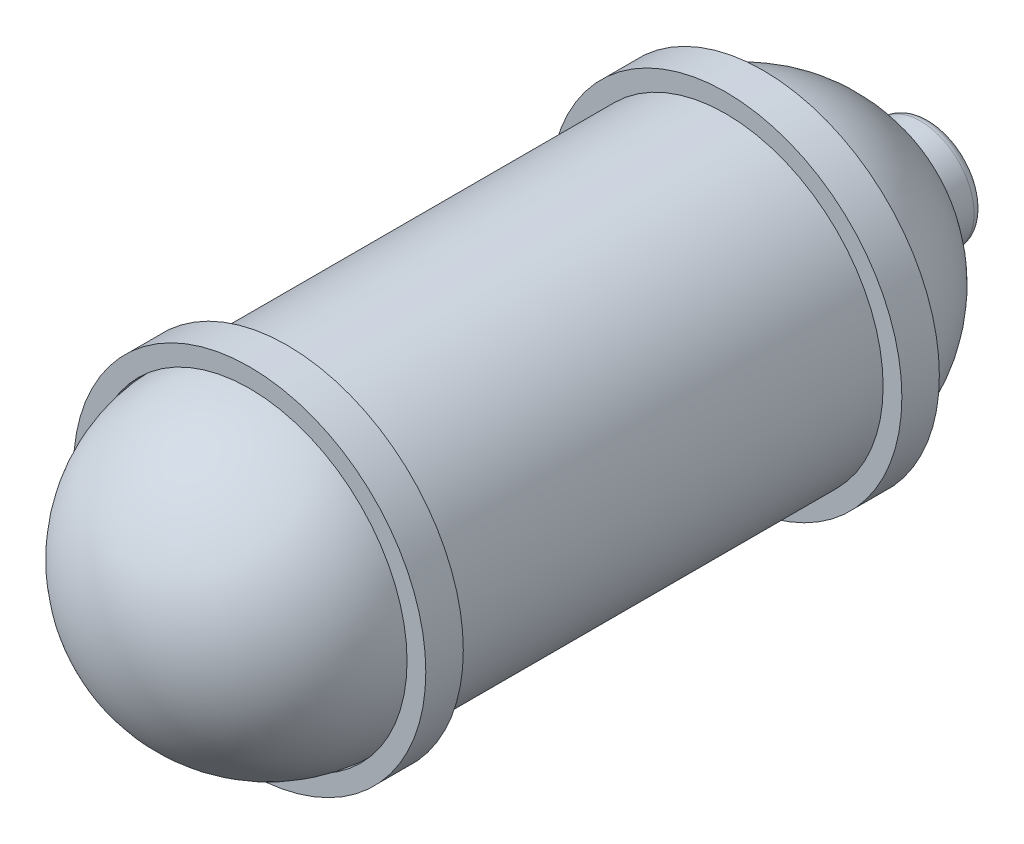
ISO-10303-21;
HEADER;
FILE_DESCRIPTION(('STEP AP214'),'2;1');
FILE_NAME('part.step','',(''),(''),'','','');
FILE_SCHEMA(('AUTOMOTIVE_DESIGN { 1 0 10303 214 1 1 1 1 }'));
ENDSEC;
DATA;
#1=APPLICATION_CONTEXT('core data for automotive mechanical design processes');
#2=APPLICATION_PROTOCOL_DEFINITION('international standard','automotive_design',2000,#1);
#3=PRODUCT_CONTEXT('',#1,'mechanical');
#4=PRODUCT('Part','Part','',(#3));
#5=PRODUCT_RELATED_PRODUCT_CATEGORY('part','',(#4));
#6=PRODUCT_DEFINITION_FORMATION('','',#4);
#7=PRODUCT_DEFINITION_CONTEXT('part definition',#1,'design');
#8=PRODUCT_DEFINITION('design','',#6,#7);
#9=PRODUCT_DEFINITION_SHAPE('','',#8);
#10=(LENGTH_UNIT() NAMED_UNIT(*) SI_UNIT(.MILLI.,.METRE.));
#11=(NAMED_UNIT(*) PLANE_ANGLE_UNIT() SI_UNIT($,.RADIAN.));
#12=(NAMED_UNIT(*) SI_UNIT($,.STERADIAN.) SOLID_ANGLE_UNIT());
#13=UNCERTAINTY_MEASURE_WITH_UNIT(LENGTH_MEASURE(1.E-05),#10,'distance_accuracy_value','');
#14=(GEOMETRIC_REPRESENTATION_CONTEXT(3) GLOBAL_UNCERTAINTY_ASSIGNED_CONTEXT((#13)) GLOBAL_UNIT_ASSIGNED_CONTEXT((#10,
#11,#12)) REPRESENTATION_CONTEXT('',''));
#15=CARTESIAN_POINT('',(0.,0.,0.));
#16=DIRECTION('',(0.,0.,1.));
#17=DIRECTION('',(1.,0.,0.));
#18=AXIS2_PLACEMENT_3D('',#15,#16,#17);
#19=CARTESIAN_POINT('',(0.,0.,-2210.));
#20=DIRECTION('',(0.,0.,1.));
#21=DIRECTION('',(1.,0.,0.));
#22=AXIS2_PLACEMENT_3D('',#19,#20,#21);
#23=TOROIDAL_SURFACE('',#22,235.482048472404,50.);
#24=CARTESIAN_POINT('',(0.,0.,-2260.));
#25=DIRECTION('',(0.,0.,1.));
#26=DIRECTION('',(1.,0.,0.));
#27=AXIS2_PLACEMENT_3D('',#24,#25,#26);
#28=CIRCLE('',#27,235.482048472404);
#29=CARTESIAN_POINT('',(235.482048472404,0.,-2260.));
#30=VERTEX_POINT('',#29);
#31=EDGE_CURVE('E47',#30,#30,#28,.F.);
#32=ORIENTED_EDGE('',*,*,#31,.F.);
#33=EDGE_LOOP('',(#32));
#34=FACE_BOUND('',#33,.T.);
#35=CARTESIAN_POINT('',(0.,0.,-2210.));
#36=DIRECTION('',(0.,0.,1.));
#37=DIRECTION('',(1.,0.,0.));
#38=AXIS2_PLACEMENT_3D('',#35,#36,#37);
#39=CIRCLE('',#38,285.482048472404);
#40=CARTESIAN_POINT('',(285.482048472404,0.,-2210.));
#41=VERTEX_POINT('',#40);
#42=EDGE_CURVE('E11',#41,#41,#39,.T.);
#43=ORIENTED_EDGE('',*,*,#42,.F.);
#44=EDGE_LOOP('',(#43));
#45=FACE_BOUND('',#44,.T.);
#46=ADVANCED_FACE('F41',(#34,#45),#23,.T.);
#47=CARTESIAN_POINT('',(0.,0.,-2260.));
#48=DIRECTION('',(0.,0.,1.));
#49=DIRECTION('',(1.,0.,0.));
#50=AXIS2_PLACEMENT_3D('',#47,#48,#49);
#51=CYLINDRICAL_SURFACE('',#50,285.482048472404);
#52=ORIENTED_EDGE('',*,*,#42,.T.);
#53=EDGE_LOOP('',(#52));
#54=FACE_BOUND('',#53,.T.);
#55=CARTESIAN_POINT('',(0.,0.,-2060.));
#56=DIRECTION('',(0.,0.,1.));
#57=DIRECTION('',(1.,0.,0.));
#58=AXIS2_PLACEMENT_3D('',#55,#56,#57);
#59=CIRCLE('',#58,285.482048472404);
#60=CARTESIAN_POINT('',(285.482048472404,0.,-2060.));
#61=VERTEX_POINT('',#60);
#62=EDGE_CURVE('E51',#61,#61,#59,.T.);
#63=ORIENTED_EDGE('',*,*,#62,.F.);
#64=EDGE_LOOP('',(#63));
#65=FACE_BOUND('',#64,.T.);
#66=ADVANCED_FACE('F60',(#54,#65),#51,.T.);
#67=CARTESIAN_POINT('',(0.,0.,-2260.));
#68=DIRECTION('',(0.,0.,1.));
#69=DIRECTION('',(1.,0.,0.));
#70=AXIS2_PLACEMENT_3D('',#67,#68,#69);
#71=PLANE('',#70);
#72=ORIENTED_EDGE('',*,*,#31,.T.);
#73=EDGE_LOOP('',(#72));
#74=FACE_BOUND('',#73,.T.);
#75=ADVANCED_FACE('F62',(#74),#71,.F.);
#76=CARTESIAN_POINT('',(0.,0.,-2060.));
#77=DIRECTION('',(0.,0.,1.));
#78=DIRECTION('',(1.,0.,0.));
#79=AXIS2_PLACEMENT_3D('',#76,#77,#78);
#80=PLANE('',#79);
#81=ORIENTED_EDGE('',*,*,#62,.T.);
#82=EDGE_LOOP('',(#81));
#83=FACE_BOUND('',#82,.T.);
#84=ADVANCED_FACE('F58',(#83),#80,.T.);
#85=CLOSED_SHELL('',(#46,#66,#75,#84));
#86=MANIFOLD_SOLID_BREP('B2',#85);
#87=CARTESIAN_POINT('',(0.,0.,-1270.));
#88=DIRECTION('',(0.,0.,1.));
#89=DIRECTION('',(0.,1.,0.));
#90=AXIS2_PLACEMENT_3D('',#87,#88,#89);
#91=SPHERICAL_SURFACE('',#90,710.);
#92=CARTESIAN_POINT('',(0.,0.,-1920.0769185258));
#93=DIRECTION('',(0.,0.,1.));
#94=DIRECTION('',(1.,0.,0.));
#95=AXIS2_PLACEMENT_3D('',#92,#93,#94);
#96=CIRCLE('',#95,285.482048472404);
#97=CARTESIAN_POINT('',(285.482048472404,0.,-1920.0769185258));
#98=VERTEX_POINT('',#97);
#99=EDGE_CURVE('E101',#98,#98,#96,.F.);
#100=ORIENTED_EDGE('',*,*,#99,.T.);
#101=EDGE_LOOP('',(#100));
#102=FACE_BOUND('',#101,.T.);
#103=CARTESIAN_POINT('',(0.,0.,-1270.));
#104=DIRECTION('',(0.,0.,1.));
#105=DIRECTION('',(1.,0.,0.));
#106=AXIS2_PLACEMENT_3D('',#103,#104,#105);
#107=CIRCLE('',#106,710.);
#108=CARTESIAN_POINT('',(-710.,0.,-1270.));
#109=VERTEX_POINT('',#108);
#110=EDGE_CURVE('E40',#109,#109,#107,.T.);
#111=ORIENTED_EDGE('',*,*,#110,.T.);
#112=EDGE_LOOP('',(#111));
#113=FACE_BOUND('',#112,.T.);
#114=ADVANCED_FACE('F97',(#102,#113),#91,.F.);
#115=CARTESIAN_POINT('',(0.,0.,1270.));
#116=DIRECTION('',(0.,0.,-1.));
#117=DIRECTION('',(-1.,0.,0.));
#118=AXIS2_PLACEMENT_3D('',#115,#116,#117);
#119=CYLINDRICAL_SURFACE('',#118,710.);
#120=CARTESIAN_POINT('',(0.,0.,1270.));
#121=DIRECTION('',(0.,0.,1.));
#122=DIRECTION('',(1.,0.,0.));
#123=AXIS2_PLACEMENT_3D('',#120,#121,#122);
#124=CIRCLE('',#123,710.);
#125=CARTESIAN_POINT('',(-710.,0.,1270.));
#126=VERTEX_POINT('',#125);
#127=EDGE_CURVE('E109',#126,#126,#124,.T.);
#128=CARTESIAN_POINT('',(-710.,0.,1270.));
#129=CARTESIAN_POINT('',(-710.,0.,1243.54166666667));
#130=CARTESIAN_POINT('',(-710.,0.,1217.08333333333));
#131=CARTESIAN_POINT('',(-710.,0.,1164.16666666667));
#132=CARTESIAN_POINT('',(-710.,0.,1137.70833333333));
#133=CARTESIAN_POINT('',(-710.,0.,1084.79166666667));
#134=CARTESIAN_POINT('',(-710.,0.,1058.33333333333));
#135=CARTESIAN_POINT('',(-710.,0.,1005.41666666667));
#136=CARTESIAN_POINT('',(-710.,0.,978.958333333333));
#137=CARTESIAN_POINT('',(-710.,0.,926.041666666667));
#138=CARTESIAN_POINT('',(-710.,0.,899.583333333333));
#139=CARTESIAN_POINT('',(-710.,0.,846.666666666666));
#140=CARTESIAN_POINT('',(-710.,0.,820.208333333333));
#141=CARTESIAN_POINT('',(-710.,0.,767.291666666666));
#142=CARTESIAN_POINT('',(-710.,0.,740.833333333333));
#143=CARTESIAN_POINT('',(-710.,0.,687.916666666666));
#144=CARTESIAN_POINT('',(-710.,0.,661.458333333333));
#145=CARTESIAN_POINT('',(-710.,0.,608.541666666666));
#146=CARTESIAN_POINT('',(-710.,0.,582.083333333333));
#147=CARTESIAN_POINT('',(-710.,0.,529.166666666666));
#148=CARTESIAN_POINT('',(-710.,0.,502.708333333333));
#149=CARTESIAN_POINT('',(-710.,0.,449.791666666666));
#150=CARTESIAN_POINT('',(-710.,0.,423.333333333333));
#151=CARTESIAN_POINT('',(-710.,0.,370.416666666666));
#152=CARTESIAN_POINT('',(-710.,0.,343.958333333333));
#153=CARTESIAN_POINT('',(-710.,0.,291.041666666666));
#154=CARTESIAN_POINT('',(-710.,0.,264.583333333333));
#155=CARTESIAN_POINT('',(-710.,0.,211.666666666666));
#156=CARTESIAN_POINT('',(-710.,0.,185.208333333333));
#157=CARTESIAN_POINT('',(-710.,0.,132.291666666666));
#158=CARTESIAN_POINT('',(-710.,0.,105.833333333333));
#159=CARTESIAN_POINT('',(-710.,0.,52.9166666666662));
#160=CARTESIAN_POINT('',(-710.,0.,26.4583333333329));
#161=CARTESIAN_POINT('',(-710.,0.,-26.4583333333338));
#162=CARTESIAN_POINT('',(-710.,0.,-52.9166666666671));
#163=CARTESIAN_POINT('',(-710.,0.,-105.833333333334));
#164=CARTESIAN_POINT('',(-710.,0.,-132.291666666667));
#165=CARTESIAN_POINT('',(-710.,0.,-185.208333333334));
#166=CARTESIAN_POINT('',(-710.,0.,-211.666666666667));
#167=CARTESIAN_POINT('',(-710.,0.,-264.583333333334));
#168=CARTESIAN_POINT('',(-710.,0.,-291.041666666667));
#169=CARTESIAN_POINT('',(-710.,0.,-343.958333333334));
#170=CARTESIAN_POINT('',(-710.,0.,-370.416666666667));
#171=CARTESIAN_POINT('',(-710.,0.,-423.333333333334));
#172=CARTESIAN_POINT('',(-710.,0.,-449.791666666667));
#173=CARTESIAN_POINT('',(-710.,0.,-502.708333333334));
#174=CARTESIAN_POINT('',(-710.,0.,-529.166666666667));
#175=CARTESIAN_POINT('',(-710.,0.,-582.083333333334));
#176=CARTESIAN_POINT('',(-710.,0.,-608.541666666667));
#177=CARTESIAN_POINT('',(-710.,0.,-661.458333333334));
#178=CARTESIAN_POINT('',(-710.,0.,-687.916666666667));
#179=CARTESIAN_POINT('',(-710.,0.,-740.833333333334));
#180=CARTESIAN_POINT('',(-710.,0.,-767.291666666667));
#181=CARTESIAN_POINT('',(-710.,0.,-820.208333333333));
#182=CARTESIAN_POINT('',(-710.,0.,-846.666666666667));
#183=CARTESIAN_POINT('',(-710.,0.,-899.583333333334));
#184=CARTESIAN_POINT('',(-710.,0.,-926.041666666667));
#185=CARTESIAN_POINT('',(-710.,0.,-978.958333333334));
#186=CARTESIAN_POINT('',(-710.,0.,-1005.41666666667));
#187=CARTESIAN_POINT('',(-710.,0.,-1058.33333333333));
#188=CARTESIAN_POINT('',(-710.,0.,-1084.79166666667));
#189=CARTESIAN_POINT('',(-710.,0.,-1137.70833333333));
#190=CARTESIAN_POINT('',(-710.,0.,-1164.16666666667));
#191=CARTESIAN_POINT('',(-710.,0.,-1217.08333333333));
#192=CARTESIAN_POINT('',(-710.,0.,-1243.54166666667));
#193=CARTESIAN_POINT('',(-710.,0.,-1270.));
#194=B_SPLINE_CURVE_WITH_KNOTS('',3,(#128,#129,#130,#131,#132,#133,#134,#135,#136,#137,#138,
#139,#140,#141,#142,#143,#144,#145,#146,#147,#148,#149,#150,#151,#152,#153,#154,#155,#156,#157,
#158,#159,#160,#161,#162,#163,#164,#165,#166,#167,#168,#169,#170,#171,#172,#173,#174,#175,#176,
#177,#178,#179,#180,#181,#182,#183,#184,#185,#186,#187,#188,#189,#190,#191,#192,#193),
.UNSPECIFIED.,.F.,.F.,(4,2,2,2,2,2,2,2,2,2,2,2,2,2,2,2,2,2,2,2,2,2,2,2,2,2,2,2,2,2,2,2,4),(0.,
79.375,158.75,238.125,317.5,396.875,476.25,555.625,635.,714.375,793.75,873.125,952.5,1031.875,
1111.25,1190.625,1270.,1349.375,1428.75,1508.125,1587.5,1666.875,1746.25,1825.625,1905.,
1984.375,2063.75,2143.125,2222.5,2301.875,2381.25,2460.625,2540.),.UNSPECIFIED.);
#195=EDGE_CURVE('BSEAM160',#126,#109,#194,.T.);
#196=ORIENTED_EDGE('',*,*,#127,.T.);
#197=ORIENTED_EDGE('',*,*,#110,.F.);
#198=ORIENTED_EDGE('',*,*,#195,.T.);
#199=ORIENTED_EDGE('',*,*,#195,.F.);
#200=EDGE_LOOP('',(#196,#198,#197,#199));
#201=FACE_BOUND('',#200,.T.);
#202=ADVANCED_FACE('F160',(#201),#119,.F.);
#203=CARTESIAN_POINT('',(0.,0.,1270.));
#204=DIRECTION('',(0.,0.,-1.));
#205=DIRECTION('',(0.,1.,0.));
#206=AXIS2_PLACEMENT_3D('',#203,#204,#205);
#207=SPHERICAL_SURFACE('',#206,710.);
#208=ORIENTED_EDGE('',*,*,#127,.F.);
#209=EDGE_LOOP('',(#208));
#210=FACE_BOUND('',#209,.T.);
#211=ADVANCED_FACE('F152',(#210),#207,.F.);
#212=CARTESIAN_POINT('',(0.,0.,-1720.));
#213=DIRECTION('',(0.,0.,-1.));
#214=DIRECTION('',(-1.,0.,0.));
#215=AXIS2_PLACEMENT_3D('',#212,#213,#214);
#216=CYLINDRICAL_SURFACE('',#215,285.482048472404);
#217=CARTESIAN_POINT('',(0.,0.,-2060.));
#218=DIRECTION('',(0.,0.,-1.));
#219=DIRECTION('',(-1.,0.,0.));
#220=AXIS2_PLACEMENT_3D('',#217,#218,#219);
#221=CIRCLE('',#220,285.482048472404);
#222=CARTESIAN_POINT('',(-285.482048472404,0.,-2060.));
#223=VERTEX_POINT('',#222);
#224=EDGE_CURVE('E141',#223,#223,#221,.T.);
#225=ORIENTED_EDGE('',*,*,#224,.T.);
#226=EDGE_LOOP('',(#225));
#227=FACE_BOUND('',#226,.T.);
#228=ORIENTED_EDGE('',*,*,#99,.F.);
#229=EDGE_LOOP('',(#228));
#230=FACE_BOUND('',#229,.T.);
#231=ADVANCED_FACE('F149',(#227,#230),#216,.F.);
#232=CARTESIAN_POINT('',(0.,0.,-1270.));
#233=DIRECTION('',(0.,0.,1.));
#234=DIRECTION('',(0.,1.,0.));
#235=AXIS2_PLACEMENT_3D('',#232,#233,#234);
#236=SPHERICAL_SURFACE('',#235,840.);
#237=CARTESIAN_POINT('',(0.,0.,-1270.));
#238=DIRECTION('',(0.,0.,1.));
#239=DIRECTION('',(1.,0.,0.));
#240=AXIS2_PLACEMENT_3D('',#237,#238,#239);
#241=CIRCLE('',#240,840.);
#242=CARTESIAN_POINT('',(840.,0.,-1270.));
#243=VERTEX_POINT('',#242);
#244=EDGE_CURVE('E105',#243,#243,#241,.T.);
#245=ORIENTED_EDGE('',*,*,#244,.F.);
#246=EDGE_LOOP('',(#245));
#247=FACE_BOUND('',#246,.T.);
#248=ORIENTED_EDGE('',*,*,#224,.F.);
#249=EDGE_LOOP('',(#248));
#250=FACE_BOUND('',#249,.T.);
#251=ADVANCED_FACE('F151',(#247,#250),#236,.T.);
#252=CARTESIAN_POINT('',(0.,0.,1270.));
#253=DIRECTION('',(0.,0.,-1.));
#254=DIRECTION('',(-1.,0.,0.));
#255=AXIS2_PLACEMENT_3D('',#252,#253,#254);
#256=CYLINDRICAL_SURFACE('',#255,840.);
#257=CARTESIAN_POINT('',(0.,0.,1170.));
#258=DIRECTION('',(0.,0.,1.));
#259=DIRECTION('',(1.,0.,0.));
#260=AXIS2_PLACEMENT_3D('',#257,#258,#259);
#261=CIRCLE('',#260,840.);
#262=CARTESIAN_POINT('',(-840.,0.,1170.));
#263=VERTEX_POINT('',#262);
#264=EDGE_CURVE('E133',#263,#263,#261,.T.);
#265=CARTESIAN_POINT('',(0.,0.,-1170.));
#266=DIRECTION('',(0.,0.,1.));
#267=DIRECTION('',(1.,0.,0.));
#268=AXIS2_PLACEMENT_3D('',#265,#266,#267);
#269=CIRCLE('',#268,840.);
#270=CARTESIAN_POINT('',(-840.,0.,-1170.));
#271=VERTEX_POINT('',#270);
#272=EDGE_CURVE('E118',#271,#271,#269,.T.);
#273=CARTESIAN_POINT('',(-840.,0.,1170.));
#274=CARTESIAN_POINT('',(-840.,0.,1145.625));
#275=CARTESIAN_POINT('',(-840.,0.,1121.25));
#276=CARTESIAN_POINT('',(-840.,0.,1072.5));
#277=CARTESIAN_POINT('',(-840.,0.,1048.125));
#278=CARTESIAN_POINT('',(-840.,0.,999.375));
#279=CARTESIAN_POINT('',(-840.,0.,975.));
#280=CARTESIAN_POINT('',(-840.,0.,926.25));
#281=CARTESIAN_POINT('',(-840.,0.,901.875));
#282=CARTESIAN_POINT('',(-840.,0.,853.125));
#283=CARTESIAN_POINT('',(-840.,0.,828.75));
#284=CARTESIAN_POINT('',(-840.,0.,780.));
#285=CARTESIAN_POINT('',(-840.,0.,755.625));
#286=CARTESIAN_POINT('',(-840.,0.,706.875));
#287=CARTESIAN_POINT('',(-840.,0.,682.5));
#288=CARTESIAN_POINT('',(-840.,0.,633.75));
#289=CARTESIAN_POINT('',(-840.,0.,609.375));
#290=CARTESIAN_POINT('',(-840.,0.,560.625));
#291=CARTESIAN_POINT('',(-840.,0.,536.25));
#292=CARTESIAN_POINT('',(-840.,0.,487.5));
#293=CARTESIAN_POINT('',(-840.,0.,463.125));
#294=CARTESIAN_POINT('',(-840.,0.,414.375));
#295=CARTESIAN_POINT('',(-840.,0.,390.));
#296=CARTESIAN_POINT('',(-840.,0.,341.25));
#297=CARTESIAN_POINT('',(-840.,0.,316.875));
#298=CARTESIAN_POINT('',(-840.,0.,268.125));
#299=CARTESIAN_POINT('',(-840.,0.,243.75));
#300=CARTESIAN_POINT('',(-840.,0.,195.));
#301=CARTESIAN_POINT('',(-840.,0.,170.625));
#302=CARTESIAN_POINT('',(-840.,0.,121.875));
#303=CARTESIAN_POINT('',(-840.,0.,97.4999999999998));
#304=CARTESIAN_POINT('',(-840.,0.,48.7499999999999));
#305=CARTESIAN_POINT('',(-840.,0.,24.3749999999998));
#306=CARTESIAN_POINT('',(-840.,0.,-24.3750000000003));
#307=CARTESIAN_POINT('',(-840.,0.,-48.7500000000003));
#308=CARTESIAN_POINT('',(-840.,0.,-97.5000000000003));
#309=CARTESIAN_POINT('',(-840.,0.,-121.875));
#310=CARTESIAN_POINT('',(-840.,0.,-170.625));
#311=CARTESIAN_POINT('',(-840.,0.,-195.));
#312=CARTESIAN_POINT('',(-840.,0.,-243.75));
#313=CARTESIAN_POINT('',(-840.,0.,-268.125));
#314=CARTESIAN_POINT('',(-840.,0.,-316.875));
#315=CARTESIAN_POINT('',(-840.,0.,-341.25));
#316=CARTESIAN_POINT('',(-840.,0.,-390.));
#317=CARTESIAN_POINT('',(-840.,0.,-414.375));
#318=CARTESIAN_POINT('',(-840.,0.,-463.125));
#319=CARTESIAN_POINT('',(-840.,0.,-487.5));
#320=CARTESIAN_POINT('',(-840.,0.,-536.25));
#321=CARTESIAN_POINT('',(-840.,0.,-560.625));
#322=CARTESIAN_POINT('',(-840.,0.,-609.375));
#323=CARTESIAN_POINT('',(-840.,0.,-633.75));
#324=CARTESIAN_POINT('',(-840.,0.,-682.5));
#325=CARTESIAN_POINT('',(-840.,0.,-706.875));
#326=CARTESIAN_POINT('',(-840.,0.,-755.625));
#327=CARTESIAN_POINT('',(-840.,0.,-780.));
#328=CARTESIAN_POINT('',(-840.,0.,-828.75));
#329=CARTESIAN_POINT('',(-840.,0.,-853.125));
#330=CARTESIAN_POINT('',(-840.,0.,-901.875));
#331=CARTESIAN_POINT('',(-840.,0.,-926.25));
#332=CARTESIAN_POINT('',(-840.,0.,-975.));
#333=CARTESIAN_POINT('',(-840.,0.,-999.375));
#334=CARTESIAN_POINT('',(-840.,0.,-1048.125));
#335=CARTESIAN_POINT('',(-840.,0.,-1072.5));
#336=CARTESIAN_POINT('',(-840.,0.,-1121.25));
#337=CARTESIAN_POINT('',(-840.,0.,-1145.625));
#338=CARTESIAN_POINT('',(-840.,0.,-1170.));
#339=B_SPLINE_CURVE_WITH_KNOTS('',3,(#273,#274,#275,#276,#277,#278,#279,#280,#281,#282,#283,
#284,#285,#286,#287,#288,#289,#290,#291,#292,#293,#294,#295,#296,#297,#298,#299,#300,#301,#302,
#303,#304,#305,#306,#307,#308,#309,#310,#311,#312,#313,#314,#315,#316,#317,#318,#319,#320,#321,
#322,#323,#324,#325,#326,#327,#328,#329,#330,#331,#332,#333,#334,#335,#336,#337,#338),
.UNSPECIFIED.,.F.,.F.,(4,2,2,2,2,2,2,2,2,2,2,2,2,2,2,2,2,2,2,2,2,2,2,2,2,2,2,2,2,2,2,2,4),(0.,
73.1249999999999,146.25,219.375,292.5,365.625,438.75,511.875,585.,658.125,731.25,804.375,877.5,
950.625,1023.75,1096.875,1170.,1243.125,1316.25,1389.375,1462.5,1535.625,1608.75,1681.875,1755.,
1828.125,1901.25,1974.375,2047.5,2120.625,2193.75,2266.875,2340.),.UNSPECIFIED.);
#340=EDGE_CURVE('BSEAM99',#263,#271,#339,.T.);
#341=ORIENTED_EDGE('',*,*,#264,.F.);
#342=ORIENTED_EDGE('',*,*,#272,.T.);
#343=ORIENTED_EDGE('',*,*,#340,.T.);
#344=ORIENTED_EDGE('',*,*,#340,.F.);
#345=EDGE_LOOP('',(#341,#343,#342,#344));
#346=FACE_BOUND('',#345,.T.);
#347=ADVANCED_FACE('F99',(#346),#256,.T.);
#348=CARTESIAN_POINT('',(0.,0.,-1170.));
#349=DIRECTION('',(0.,0.,1.));
#350=DIRECTION('',(1.,0.,0.));
#351=AXIS2_PLACEMENT_3D('',#348,#349,#350);
#352=PLANE('',#351);
#353=CARTESIAN_POINT('',(0.,0.,-1170.));
#354=DIRECTION('',(0.,0.,1.));
#355=DIRECTION('',(1.,0.,0.));
#356=AXIS2_PLACEMENT_3D('',#353,#354,#355);
#357=CIRCLE('',#356,940.);
#358=CARTESIAN_POINT('',(940.,0.,-1170.));
#359=VERTEX_POINT('',#358);
#360=EDGE_CURVE('E114',#359,#359,#357,.T.);
#361=ORIENTED_EDGE('',*,*,#360,.T.);
#362=EDGE_LOOP('',(#361));
#363=FACE_BOUND('',#362,.T.);
#364=ORIENTED_EDGE('',*,*,#272,.F.);
#365=EDGE_LOOP('',(#364));
#366=FACE_BOUND('',#365,.T.);
#367=ADVANCED_FACE('F184',(#363,#366),#352,.T.);
#368=CARTESIAN_POINT('',(0.,0.,-1370.));
#369=DIRECTION('',(0.,0.,1.));
#370=DIRECTION('',(1.,0.,0.));
#371=AXIS2_PLACEMENT_3D('',#368,#369,#370);
#372=PLANE('',#371);
#373=CARTESIAN_POINT('',(0.,0.,-1370.));
#374=DIRECTION('',(0.,0.,1.));
#375=DIRECTION('',(1.,0.,0.));
#376=AXIS2_PLACEMENT_3D('',#373,#374,#375);
#377=CIRCLE('',#376,940.);
#378=CARTESIAN_POINT('',(940.,0.,-1370.));
#379=VERTEX_POINT('',#378);
#380=EDGE_CURVE('E115',#379,#379,#377,.T.);
#381=ORIENTED_EDGE('',*,*,#380,.F.);
#382=EDGE_LOOP('',(#381));
#383=FACE_BOUND('',#382,.T.);
#384=CARTESIAN_POINT('',(0.,0.,-1370.));
#385=DIRECTION('',(0.,0.,1.));
#386=DIRECTION('',(1.,0.,0.));
#387=AXIS2_PLACEMENT_3D('',#384,#385,#386);
#388=CIRCLE('',#387,840.);
#389=CARTESIAN_POINT('',(840.,0.,-1370.));
#390=VERTEX_POINT('',#389);
#391=EDGE_CURVE('E121',#390,#390,#388,.T.);
#392=ORIENTED_EDGE('',*,*,#391,.T.);
#393=EDGE_LOOP('',(#392));
#394=FACE_BOUND('',#393,.T.);
#395=ADVANCED_FACE('F180',(#383,#394),#372,.F.);
#396=CARTESIAN_POINT('',(0.,0.,-1170.));
#397=DIRECTION('',(0.,0.,-1.));
#398=DIRECTION('',(-1.,0.,0.));
#399=AXIS2_PLACEMENT_3D('',#396,#397,#398);
#400=CYLINDRICAL_SURFACE('',#399,940.);
#401=ORIENTED_EDGE('',*,*,#360,.F.);
#402=EDGE_LOOP('',(#401));
#403=FACE_BOUND('',#402,.T.);
#404=ORIENTED_EDGE('',*,*,#380,.T.);
#405=EDGE_LOOP('',(#404));
#406=FACE_BOUND('',#405,.T.);
#407=ADVANCED_FACE('F176',(#403,#406),#400,.T.);
#408=CARTESIAN_POINT('',(0.,0.,-1170.));
#409=DIRECTION('',(0.,0.,-1.));
#410=DIRECTION('',(-1.,0.,0.));
#411=AXIS2_PLACEMENT_3D('',#408,#409,#410);
#412=CYLINDRICAL_SURFACE('',#411,840.);
#413=ORIENTED_EDGE('',*,*,#244,.T.);
#414=EDGE_LOOP('',(#413));
#415=FACE_BOUND('',#414,.T.);
#416=ORIENTED_EDGE('',*,*,#391,.F.);
#417=EDGE_LOOP('',(#416));
#418=FACE_BOUND('',#417,.T.);
#419=ADVANCED_FACE('F179',(#415,#418),#412,.F.);
#420=CARTESIAN_POINT('',(0.,0.,1170.));
#421=DIRECTION('',(0.,0.,1.));
#422=DIRECTION('',(1.,0.,0.));
#423=AXIS2_PLACEMENT_3D('',#420,#421,#422);
#424=CYLINDRICAL_SURFACE('',#423,940.);
#425=CARTESIAN_POINT('',(0.,0.,1170.));
#426=DIRECTION('',(0.,0.,1.));
#427=DIRECTION('',(1.,0.,0.));
#428=AXIS2_PLACEMENT_3D('',#425,#426,#427);
#429=CIRCLE('',#428,940.);
#430=CARTESIAN_POINT('',(940.,0.,1170.));
#431=VERTEX_POINT('',#430);
#432=EDGE_CURVE('E129',#431,#431,#429,.T.);
#433=ORIENTED_EDGE('',*,*,#432,.T.);
#434=EDGE_LOOP('',(#433));
#435=FACE_BOUND('',#434,.T.);
#436=CARTESIAN_POINT('',(0.,0.,1370.));
#437=DIRECTION('',(0.,0.,1.));
#438=DIRECTION('',(1.,0.,0.));
#439=AXIS2_PLACEMENT_3D('',#436,#437,#438);
#440=CIRCLE('',#439,940.);
#441=CARTESIAN_POINT('',(940.,0.,1370.));
#442=VERTEX_POINT('',#441);
#443=EDGE_CURVE('E130',#442,#442,#440,.T.);
#444=ORIENTED_EDGE('',*,*,#443,.F.);
#445=EDGE_LOOP('',(#444));
#446=FACE_BOUND('',#445,.T.);
#447=ADVANCED_FACE('F191',(#435,#446),#424,.T.);
#448=CARTESIAN_POINT('',(0.,0.,1170.));
#449=DIRECTION('',(0.,0.,-1.));
#450=DIRECTION('',(1.,0.,0.));
#451=AXIS2_PLACEMENT_3D('',#448,#449,#450);
#452=PLANE('',#451);
#453=ORIENTED_EDGE('',*,*,#264,.T.);
#454=EDGE_LOOP('',(#453));
#455=FACE_BOUND('',#454,.T.);
#456=ORIENTED_EDGE('',*,*,#432,.F.);
#457=EDGE_LOOP('',(#456));
#458=FACE_BOUND('',#457,.T.);
#459=ADVANCED_FACE('F195',(#455,#458),#452,.T.);
#460=CARTESIAN_POINT('',(0.,0.,1370.));
#461=DIRECTION('',(0.,0.,-1.));
#462=DIRECTION('',(1.,0.,0.));
#463=AXIS2_PLACEMENT_3D('',#460,#461,#462);
#464=PLANE('',#463);
#465=CARTESIAN_POINT('',(0.,0.,1370.));
#466=DIRECTION('',(0.,0.,1.));
#467=DIRECTION('',(1.,0.,0.));
#468=AXIS2_PLACEMENT_3D('',#465,#466,#467);
#469=CIRCLE('',#468,840.);
#470=CARTESIAN_POINT('',(840.,0.,1370.));
#471=VERTEX_POINT('',#470);
#472=EDGE_CURVE('E136',#471,#471,#469,.T.);
#473=ORIENTED_EDGE('',*,*,#472,.F.);
#474=EDGE_LOOP('',(#473));
#475=FACE_BOUND('',#474,.T.);
#476=ORIENTED_EDGE('',*,*,#443,.T.);
#477=EDGE_LOOP('',(#476));
#478=FACE_BOUND('',#477,.T.);
#479=ADVANCED_FACE('F197',(#475,#478),#464,.F.);
#480=CARTESIAN_POINT('',(0.,0.,1170.));
#481=DIRECTION('',(0.,0.,1.));
#482=DIRECTION('',(1.,0.,0.));
#483=AXIS2_PLACEMENT_3D('',#480,#481,#482);
#484=CYLINDRICAL_SURFACE('',#483,840.);
#485=CARTESIAN_POINT('',(0.,0.,1270.));
#486=DIRECTION('',(0.,0.,1.));
#487=DIRECTION('',(1.,0.,0.));
#488=AXIS2_PLACEMENT_3D('',#485,#486,#487);
#489=CIRCLE('',#488,840.);
#490=CARTESIAN_POINT('',(840.,0.,1270.));
#491=VERTEX_POINT('',#490);
#492=EDGE_CURVE('E124',#491,#491,#489,.T.);
#493=ORIENTED_EDGE('',*,*,#492,.F.);
#494=EDGE_LOOP('',(#493));
#495=FACE_BOUND('',#494,.T.);
#496=ORIENTED_EDGE('',*,*,#472,.T.);
#497=EDGE_LOOP('',(#496));
#498=FACE_BOUND('',#497,.T.);
#499=ADVANCED_FACE('F173',(#495,#498),#484,.F.);
#500=CARTESIAN_POINT('',(0.,0.,1270.));
#501=DIRECTION('',(0.,0.,-1.));
#502=DIRECTION('',(0.,1.,0.));
#503=AXIS2_PLACEMENT_3D('',#500,#501,#502);
#504=SPHERICAL_SURFACE('',#503,840.);
#505=ORIENTED_EDGE('',*,*,#492,.T.);
#506=EDGE_LOOP('',(#505));
#507=FACE_BOUND('',#506,.T.);
#508=ADVANCED_FACE('F171',(#507),#504,.T.);
#509=CLOSED_SHELL('',(#114,#202,#211,#231,#251,#347,#367,#395,#407,#419,#447,#459,#479,#499,#508));
#510=MANIFOLD_SOLID_BREP('B6',#509);
#511=ADVANCED_BREP_SHAPE_REPRESENTATION('',(#18,#86,#510),#14);
#512=SHAPE_DEFINITION_REPRESENTATION(#9,#511);
ENDSEC;
END-ISO-10303-21;
